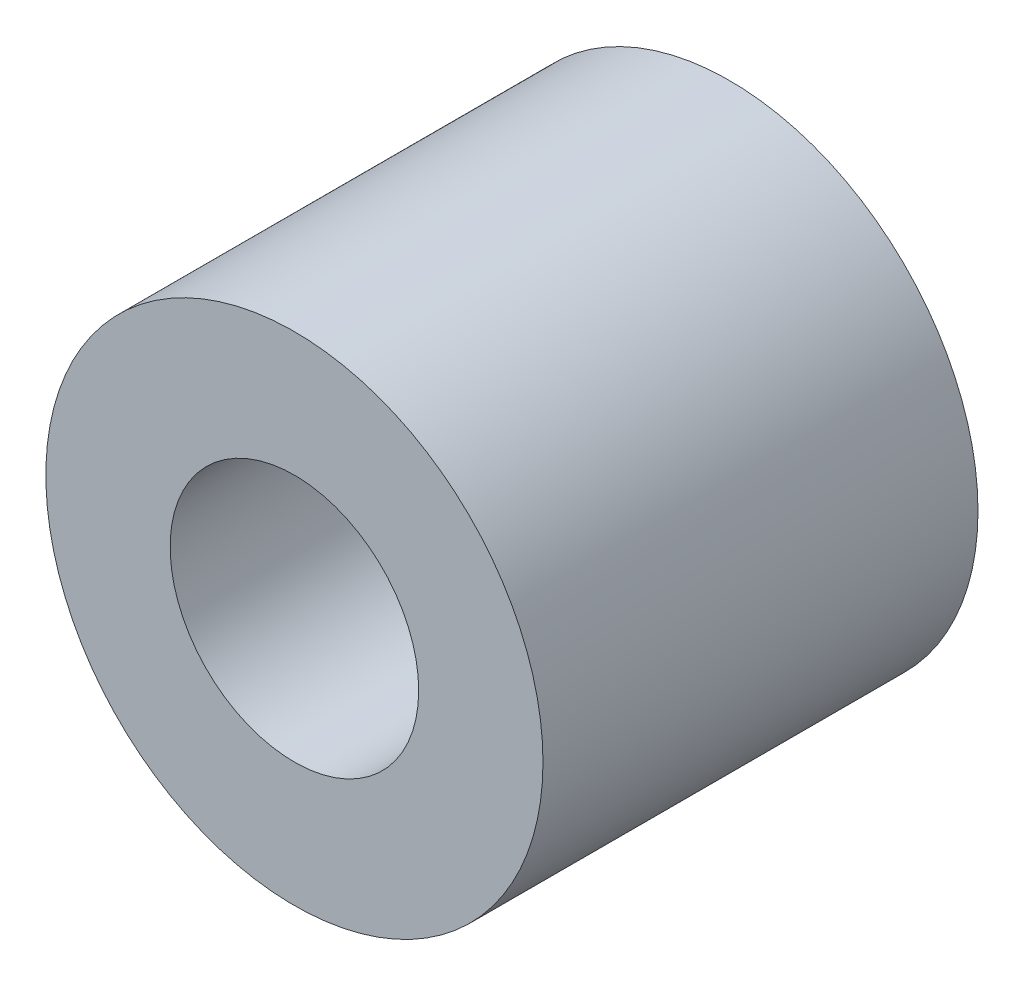
ISO-10303-21;
HEADER;
FILE_DESCRIPTION(('STEP AP214'),'2;1');
FILE_NAME('part.step','',(''),(''),'','','');
FILE_SCHEMA(('AUTOMOTIVE_DESIGN { 1 0 10303 214 1 1 1 1 }'));
ENDSEC;
DATA;
#1=APPLICATION_CONTEXT('core data for automotive mechanical design processes');
#2=APPLICATION_PROTOCOL_DEFINITION('international standard','automotive_design',2000,#1);
#3=PRODUCT_CONTEXT('',#1,'mechanical');
#4=PRODUCT('Part','Part','',(#3));
#5=PRODUCT_RELATED_PRODUCT_CATEGORY('part','',(#4));
#6=PRODUCT_DEFINITION_FORMATION('','',#4);
#7=PRODUCT_DEFINITION_CONTEXT('part definition',#1,'design');
#8=PRODUCT_DEFINITION('design','',#6,#7);
#9=PRODUCT_DEFINITION_SHAPE('','',#8);
#10=(LENGTH_UNIT() NAMED_UNIT(*) SI_UNIT(.MILLI.,.METRE.));
#11=(NAMED_UNIT(*) PLANE_ANGLE_UNIT() SI_UNIT($,.RADIAN.));
#12=(NAMED_UNIT(*) SI_UNIT($,.STERADIAN.) SOLID_ANGLE_UNIT());
#13=UNCERTAINTY_MEASURE_WITH_UNIT(LENGTH_MEASURE(1.E-05),#10,'distance_accuracy_value','');
#14=(GEOMETRIC_REPRESENTATION_CONTEXT(3) GLOBAL_UNCERTAINTY_ASSIGNED_CONTEXT((#13)) GLOBAL_UNIT_ASSIGNED_CONTEXT((#10,
#11,#12)) REPRESENTATION_CONTEXT('',''));
#15=CARTESIAN_POINT('',(0.,0.,0.));
#16=DIRECTION('',(0.,0.,1.));
#17=DIRECTION('',(1.,0.,0.));
#18=AXIS2_PLACEMENT_3D('',#15,#16,#17);
#19=CARTESIAN_POINT('',(0.,0.,-11.1125));
#20=DIRECTION('',(0.,0.,1.));
#21=DIRECTION('',(1.,0.,0.));
#22=AXIS2_PLACEMENT_3D('',#19,#20,#21);
#23=CYLINDRICAL_SURFACE('',#22,6.35);
#24=CARTESIAN_POINT('',(0.,0.,-11.1125));
#25=DIRECTION('',(0.,0.,1.));
#26=DIRECTION('',(1.,0.,0.));
#27=AXIS2_PLACEMENT_3D('',#24,#25,#26);
#28=CIRCLE('',#27,6.35);
#29=CARTESIAN_POINT('',(6.35,0.,-11.1125));
#30=VERTEX_POINT('',#29);
#31=EDGE_CURVE('E10',#30,#30,#28,.T.);
#32=ORIENTED_EDGE('',*,*,#31,.T.);
#33=EDGE_LOOP('',(#32));
#34=FACE_BOUND('',#33,.T.);
#35=CARTESIAN_POINT('',(0.,0.,0.));
#36=DIRECTION('',(0.,0.,1.));
#37=DIRECTION('',(1.,0.,0.));
#38=AXIS2_PLACEMENT_3D('',#35,#36,#37);
#39=CIRCLE('',#38,6.35);
#40=CARTESIAN_POINT('',(6.35,0.,0.));
#41=VERTEX_POINT('',#40);
#42=EDGE_CURVE('E35',#41,#41,#39,.T.);
#43=ORIENTED_EDGE('',*,*,#42,.F.);
#44=EDGE_LOOP('',(#43));
#45=FACE_BOUND('',#44,.T.);
#46=ADVANCED_FACE('F32',(#34,#45),#23,.T.);
#47=CARTESIAN_POINT('',(0.,0.,-11.1125));
#48=DIRECTION('',(0.,0.,1.));
#49=DIRECTION('',(1.,0.,0.));
#50=AXIS2_PLACEMENT_3D('',#47,#48,#49);
#51=PLANE('',#50);
#52=CARTESIAN_POINT('',(0.,0.,-11.1125));
#53=DIRECTION('',(0.,0.,1.));
#54=DIRECTION('',(1.,0.,0.));
#55=AXIS2_PLACEMENT_3D('',#52,#53,#54);
#56=CIRCLE('',#55,3.175);
#57=CARTESIAN_POINT('',(3.175,0.,-11.1125));
#58=VERTEX_POINT('',#57);
#59=EDGE_CURVE('E42',#58,#58,#56,.T.);
#60=ORIENTED_EDGE('',*,*,#59,.T.);
#61=EDGE_LOOP('',(#60));
#62=FACE_BOUND('',#61,.T.);
#63=ORIENTED_EDGE('',*,*,#31,.F.);
#64=EDGE_LOOP('',(#63));
#65=FACE_BOUND('',#64,.T.);
#66=ADVANCED_FACE('F50',(#62,#65),#51,.F.);
#67=CARTESIAN_POINT('',(0.,0.,0.));
#68=DIRECTION('',(0.,0.,1.));
#69=DIRECTION('',(1.,0.,0.));
#70=AXIS2_PLACEMENT_3D('',#67,#68,#69);
#71=PLANE('',#70);
#72=CARTESIAN_POINT('',(0.,0.,0.));
#73=DIRECTION('',(0.,0.,1.));
#74=DIRECTION('',(1.,0.,0.));
#75=AXIS2_PLACEMENT_3D('',#72,#73,#74);
#76=CIRCLE('',#75,3.175);
#77=CARTESIAN_POINT('',(3.175,0.,0.));
#78=VERTEX_POINT('',#77);
#79=EDGE_CURVE('E44',#78,#78,#76,.T.);
#80=ORIENTED_EDGE('',*,*,#79,.F.);
#81=EDGE_LOOP('',(#80));
#82=FACE_BOUND('',#81,.T.);
#83=ORIENTED_EDGE('',*,*,#42,.T.);
#84=EDGE_LOOP('',(#83));
#85=FACE_BOUND('',#84,.T.);
#86=ADVANCED_FACE('F56',(#82,#85),#71,.T.);
#87=CARTESIAN_POINT('',(0.,0.,-11.1125));
#88=DIRECTION('',(0.,0.,1.));
#89=DIRECTION('',(1.,0.,0.));
#90=AXIS2_PLACEMENT_3D('',#87,#88,#89);
#91=CYLINDRICAL_SURFACE('',#90,3.175);
#92=ORIENTED_EDGE('',*,*,#59,.F.);
#93=EDGE_LOOP('',(#92));
#94=FACE_BOUND('',#93,.T.);
#95=ORIENTED_EDGE('',*,*,#79,.T.);
#96=EDGE_LOOP('',(#95));
#97=FACE_BOUND('',#96,.T.);
#98=ADVANCED_FACE('F53',(#94,#97),#91,.F.);
#99=CLOSED_SHELL('',(#46,#66,#86,#98));
#100=MANIFOLD_SOLID_BREP('B2',#99);
#101=ADVANCED_BREP_SHAPE_REPRESENTATION('',(#18,#100),#14);
#102=SHAPE_DEFINITION_REPRESENTATION(#9,#101);
ENDSEC;
END-ISO-10303-21;
